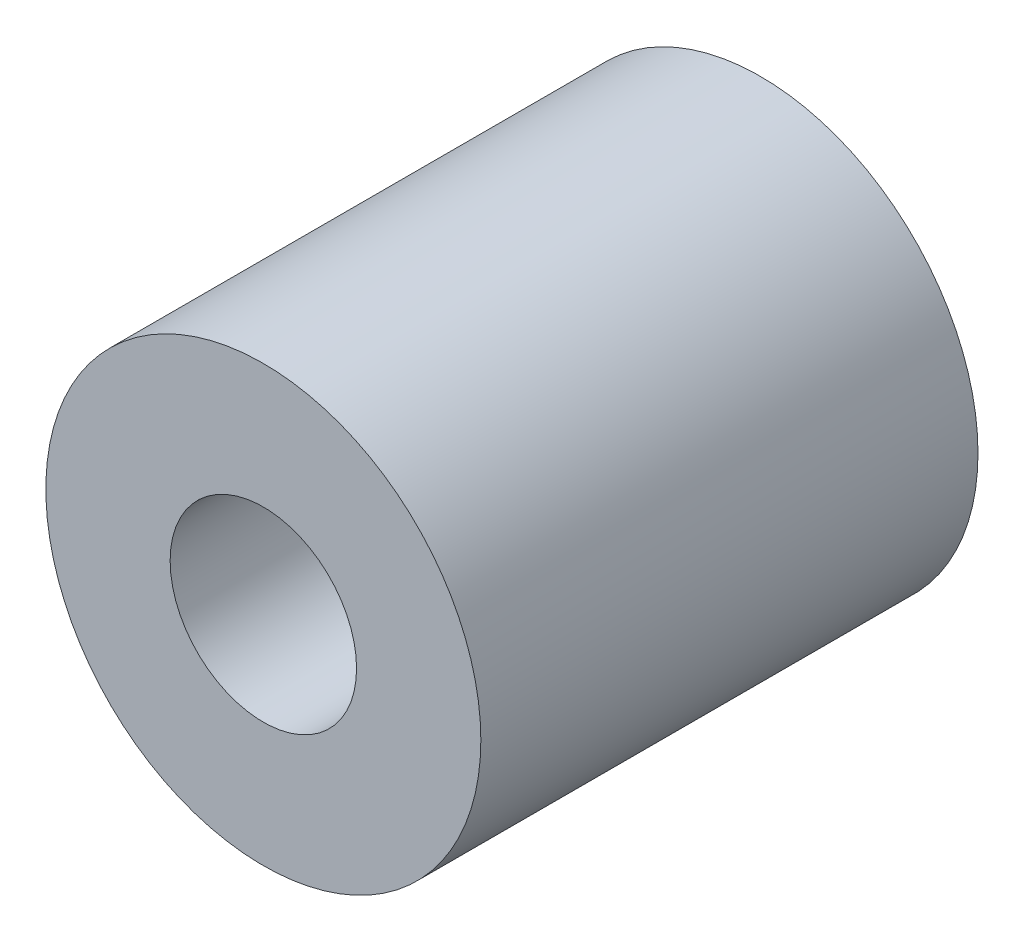
ISO-10303-21;
HEADER;
FILE_DESCRIPTION(('STEP AP214'),'2;1');
FILE_NAME('part.step','',(''),(''),'','','');
FILE_SCHEMA(('AUTOMOTIVE_DESIGN { 1 0 10303 214 1 1 1 1 }'));
ENDSEC;
DATA;
#1=APPLICATION_CONTEXT('core data for automotive mechanical design processes');
#2=APPLICATION_PROTOCOL_DEFINITION('international standard','automotive_design',2000,#1);
#3=PRODUCT_CONTEXT('',#1,'mechanical');
#4=PRODUCT('Part','Part','',(#3));
#5=PRODUCT_RELATED_PRODUCT_CATEGORY('part','',(#4));
#6=PRODUCT_DEFINITION_FORMATION('','',#4);
#7=PRODUCT_DEFINITION_CONTEXT('part definition',#1,'design');
#8=PRODUCT_DEFINITION('design','',#6,#7);
#9=PRODUCT_DEFINITION_SHAPE('','',#8);
#10=(LENGTH_UNIT() NAMED_UNIT(*) SI_UNIT(.MILLI.,.METRE.));
#11=(NAMED_UNIT(*) PLANE_ANGLE_UNIT() SI_UNIT($,.RADIAN.));
#12=(NAMED_UNIT(*) SI_UNIT($,.STERADIAN.) SOLID_ANGLE_UNIT());
#13=UNCERTAINTY_MEASURE_WITH_UNIT(LENGTH_MEASURE(1.E-05),#10,'distance_accuracy_value','');
#14=(GEOMETRIC_REPRESENTATION_CONTEXT(3) GLOBAL_UNCERTAINTY_ASSIGNED_CONTEXT((#13)) GLOBAL_UNIT_ASSIGNED_CONTEXT((#10,
#11,#12)) REPRESENTATION_CONTEXT('',''));
#15=CARTESIAN_POINT('',(0.,0.,0.));
#16=DIRECTION('',(0.,0.,1.));
#17=DIRECTION('',(1.,0.,0.));
#18=AXIS2_PLACEMENT_3D('',#15,#16,#17);
#19=CARTESIAN_POINT('',(0.,0.,8.));
#20=DIRECTION('',(0.,0.,1.));
#21=DIRECTION('',(1.,0.,0.));
#22=AXIS2_PLACEMENT_3D('',#19,#20,#21);
#23=PLANE('',#22);
#24=CARTESIAN_POINT('',(0.,0.,8.));
#25=DIRECTION('',(0.,0.,1.));
#26=DIRECTION('',(1.,0.,0.));
#27=AXIS2_PLACEMENT_3D('',#24,#25,#26);
#28=CIRCLE('',#27,3.5);
#29=CARTESIAN_POINT('',(3.5,0.,8.));
#30=VERTEX_POINT('',#29);
#31=EDGE_CURVE('E10',#30,#30,#28,.T.);
#32=ORIENTED_EDGE('',*,*,#31,.T.);
#33=EDGE_LOOP('',(#32));
#34=FACE_BOUND('',#33,.T.);
#35=CARTESIAN_POINT('',(0.,0.,8.));
#36=DIRECTION('',(0.,0.,1.));
#37=DIRECTION('',(1.,0.,0.));
#38=AXIS2_PLACEMENT_3D('',#35,#36,#37);
#39=CIRCLE('',#38,1.5);
#40=CARTESIAN_POINT('',(1.5,0.,8.));
#41=VERTEX_POINT('',#40);
#42=EDGE_CURVE('E45',#41,#41,#39,.T.);
#43=ORIENTED_EDGE('',*,*,#42,.F.);
#44=EDGE_LOOP('',(#43));
#45=FACE_BOUND('',#44,.T.);
#46=ADVANCED_FACE('F34',(#34,#45),#23,.T.);
#47=CARTESIAN_POINT('',(0.,0.,0.));
#48=DIRECTION('',(0.,0.,1.));
#49=DIRECTION('',(1.,0.,0.));
#50=AXIS2_PLACEMENT_3D('',#47,#48,#49);
#51=PLANE('',#50);
#52=CARTESIAN_POINT('',(0.,0.,0.));
#53=DIRECTION('',(0.,0.,1.));
#54=DIRECTION('',(1.,0.,0.));
#55=AXIS2_PLACEMENT_3D('',#52,#53,#54);
#56=CIRCLE('',#55,3.5);
#57=CARTESIAN_POINT('',(3.5,0.,0.));
#58=VERTEX_POINT('',#57);
#59=EDGE_CURVE('E38',#58,#58,#56,.T.);
#60=ORIENTED_EDGE('',*,*,#59,.F.);
#61=EDGE_LOOP('',(#60));
#62=FACE_BOUND('',#61,.T.);
#63=CARTESIAN_POINT('',(0.,0.,0.));
#64=DIRECTION('',(0.,0.,1.));
#65=DIRECTION('',(1.,0.,0.));
#66=AXIS2_PLACEMENT_3D('',#63,#64,#65);
#67=CIRCLE('',#66,1.5);
#68=CARTESIAN_POINT('',(1.5,0.,0.));
#69=VERTEX_POINT('',#68);
#70=EDGE_CURVE('E47',#69,#69,#67,.T.);
#71=ORIENTED_EDGE('',*,*,#70,.T.);
#72=EDGE_LOOP('',(#71));
#73=FACE_BOUND('',#72,.T.);
#74=ADVANCED_FACE('F57',(#62,#73),#51,.F.);
#75=CARTESIAN_POINT('',(0.,0.,8.));
#76=DIRECTION('',(0.,0.,-1.));
#77=DIRECTION('',(-1.,0.,0.));
#78=AXIS2_PLACEMENT_3D('',#75,#76,#77);
#79=CYLINDRICAL_SURFACE('',#78,3.5);
#80=ORIENTED_EDGE('',*,*,#31,.F.);
#81=EDGE_LOOP('',(#80));
#82=FACE_BOUND('',#81,.T.);
#83=ORIENTED_EDGE('',*,*,#59,.T.);
#84=EDGE_LOOP('',(#83));
#85=FACE_BOUND('',#84,.T.);
#86=ADVANCED_FACE('F36',(#82,#85),#79,.T.);
#87=CARTESIAN_POINT('',(0.,0.,8.));
#88=DIRECTION('',(0.,0.,-1.));
#89=DIRECTION('',(-1.,0.,0.));
#90=AXIS2_PLACEMENT_3D('',#87,#88,#89);
#91=CYLINDRICAL_SURFACE('',#90,1.5);
#92=ORIENTED_EDGE('',*,*,#42,.T.);
#93=EDGE_LOOP('',(#92));
#94=FACE_BOUND('',#93,.T.);
#95=ORIENTED_EDGE('',*,*,#70,.F.);
#96=EDGE_LOOP('',(#95));
#97=FACE_BOUND('',#96,.T.);
#98=ADVANCED_FACE('F53',(#94,#97),#91,.F.);
#99=CLOSED_SHELL('',(#46,#74,#86,#98));
#100=MANIFOLD_SOLID_BREP('B2',#99);
#101=ADVANCED_BREP_SHAPE_REPRESENTATION('',(#18,#100),#14);
#102=SHAPE_DEFINITION_REPRESENTATION(#9,#101);
ENDSEC;
END-ISO-10303-21;
